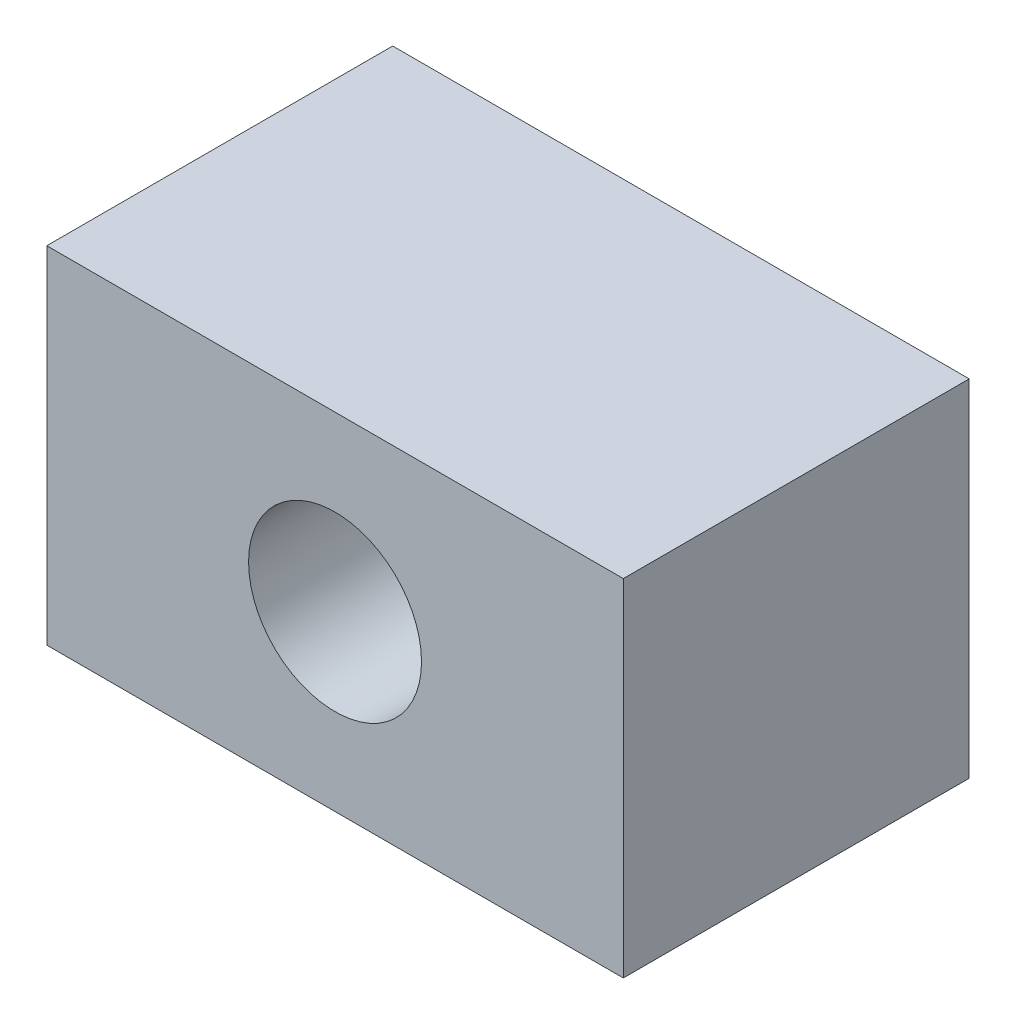
ISO-10303-21;
HEADER;
FILE_DESCRIPTION(('STEP AP214'),'2;1');
FILE_NAME('part.step','',(''),(''),'','','');
FILE_SCHEMA(('AUTOMOTIVE_DESIGN { 1 0 10303 214 1 1 1 1 }'));
ENDSEC;
DATA;
#1=APPLICATION_CONTEXT('core data for automotive mechanical design processes');
#2=APPLICATION_PROTOCOL_DEFINITION('international standard','automotive_design',2000,#1);
#3=PRODUCT_CONTEXT('',#1,'mechanical');
#4=PRODUCT('Part','Part','',(#3));
#5=PRODUCT_RELATED_PRODUCT_CATEGORY('part','',(#4));
#6=PRODUCT_DEFINITION_FORMATION('','',#4);
#7=PRODUCT_DEFINITION_CONTEXT('part definition',#1,'design');
#8=PRODUCT_DEFINITION('design','',#6,#7);
#9=PRODUCT_DEFINITION_SHAPE('','',#8);
#10=(LENGTH_UNIT() NAMED_UNIT(*) SI_UNIT(.MILLI.,.METRE.));
#11=(NAMED_UNIT(*) PLANE_ANGLE_UNIT() SI_UNIT($,.RADIAN.));
#12=(NAMED_UNIT(*) SI_UNIT($,.STERADIAN.) SOLID_ANGLE_UNIT());
#13=UNCERTAINTY_MEASURE_WITH_UNIT(LENGTH_MEASURE(1.E-05),#10,'distance_accuracy_value','');
#14=(GEOMETRIC_REPRESENTATION_CONTEXT(3) GLOBAL_UNCERTAINTY_ASSIGNED_CONTEXT((#13)) GLOBAL_UNIT_ASSIGNED_CONTEXT((#10,
#11,#12)) REPRESENTATION_CONTEXT('',''));
#15=CARTESIAN_POINT('',(0.,0.,0.));
#16=DIRECTION('',(0.,0.,1.));
#17=DIRECTION('',(1.,0.,0.));
#18=AXIS2_PLACEMENT_3D('',#15,#16,#17);
#19=CARTESIAN_POINT('',(50.,-15.,-15.));
#20=DIRECTION('',(0.,0.,1.));
#21=DIRECTION('',(1.,0.,0.));
#22=AXIS2_PLACEMENT_3D('',#19,#20,#21);
#23=PLANE('',#22);
#24=CARTESIAN_POINT('',(25.,0.,-15.));
#25=DIRECTION('',(0.,0.,1.));
#26=DIRECTION('',(1.,0.,0.));
#27=AXIS2_PLACEMENT_3D('',#24,#25,#26);
#28=CIRCLE('',#27,7.5);
#29=CARTESIAN_POINT('',(32.5,0.,-15.));
#30=VERTEX_POINT('',#29);
#31=EDGE_CURVE('E111',#30,#30,#28,.T.);
#32=ORIENTED_EDGE('',*,*,#31,.T.);
#33=EDGE_LOOP('',(#32));
#34=FACE_BOUND('',#33,.T.);
#35=DIRECTION('',(0.,1.,0.));
#36=VECTOR('',#35,1.);
#37=CARTESIAN_POINT('',(0.,-15.,-15.));
#38=LINE('',#37,#36);
#39=CARTESIAN_POINT('',(0.,-15.,-15.));
#40=VERTEX_POINT('',#39);
#41=CARTESIAN_POINT('',(0.,15.,-15.));
#42=VERTEX_POINT('',#41);
#43=EDGE_CURVE('E107',#40,#42,#38,.T.);
#44=ORIENTED_EDGE('',*,*,#43,.T.);
#45=DIRECTION('',(-1.,0.,0.));
#46=VECTOR('',#45,1.);
#47=CARTESIAN_POINT('',(50.,15.,-15.));
#48=LINE('',#47,#46);
#49=CARTESIAN_POINT('',(50.,15.,-15.));
#50=VERTEX_POINT('',#49);
#51=EDGE_CURVE('E11',#50,#42,#48,.T.);
#52=ORIENTED_EDGE('',*,*,#51,.F.);
#53=DIRECTION('',(0.,1.,0.));
#54=VECTOR('',#53,1.);
#55=CARTESIAN_POINT('',(50.,-15.,-15.));
#56=LINE('',#55,#54);
#57=CARTESIAN_POINT('',(50.,-15.,-15.));
#58=VERTEX_POINT('',#57);
#59=EDGE_CURVE('E91',#58,#50,#56,.T.);
#60=ORIENTED_EDGE('',*,*,#59,.F.);
#61=DIRECTION('',(-1.,0.,0.));
#62=VECTOR('',#61,1.);
#63=CARTESIAN_POINT('',(50.,-15.,-15.));
#64=LINE('',#63,#62);
#65=EDGE_CURVE('E103',#58,#40,#64,.T.);
#66=ORIENTED_EDGE('',*,*,#65,.T.);
#67=EDGE_LOOP('',(#44,#52,#60,#66));
#68=FACE_BOUND('',#67,.T.);
#69=ADVANCED_FACE('F39',(#34,#68),#23,.F.);
#70=CARTESIAN_POINT('',(50.,15.,15.));
#71=DIRECTION('',(0.,-1.,0.));
#72=DIRECTION('',(0.,0.,-1.));
#73=AXIS2_PLACEMENT_3D('',#70,#71,#72);
#74=PLANE('',#73);
#75=DIRECTION('',(0.,0.,1.));
#76=VECTOR('',#75,1.);
#77=CARTESIAN_POINT('',(0.,15.,15.));
#78=LINE('',#77,#76);
#79=CARTESIAN_POINT('',(0.,15.,15.));
#80=VERTEX_POINT('',#79);
#81=EDGE_CURVE('E96',#42,#80,#78,.T.);
#82=ORIENTED_EDGE('',*,*,#81,.T.);
#83=DIRECTION('',(-1.,0.,0.));
#84=VECTOR('',#83,1.);
#85=CARTESIAN_POINT('',(50.,15.,15.));
#86=LINE('',#85,#84);
#87=CARTESIAN_POINT('',(50.,15.,15.));
#88=VERTEX_POINT('',#87);
#89=EDGE_CURVE('E48',#88,#80,#86,.T.);
#90=ORIENTED_EDGE('',*,*,#89,.F.);
#91=DIRECTION('',(0.,0.,1.));
#92=VECTOR('',#91,1.);
#93=CARTESIAN_POINT('',(50.,15.,15.));
#94=LINE('',#93,#92);
#95=EDGE_CURVE('E86',#50,#88,#94,.T.);
#96=ORIENTED_EDGE('',*,*,#95,.F.);
#97=ORIENTED_EDGE('',*,*,#51,.T.);
#98=EDGE_LOOP('',(#82,#90,#96,#97));
#99=FACE_BOUND('',#98,.T.);
#100=ADVANCED_FACE('F95',(#99),#74,.F.);
#101=CARTESIAN_POINT('',(50.,-15.,15.));
#102=DIRECTION('',(0.,0.,-1.));
#103=DIRECTION('',(-1.,0.,0.));
#104=AXIS2_PLACEMENT_3D('',#101,#102,#103);
#105=PLANE('',#104);
#106=CARTESIAN_POINT('',(25.,0.,15.));
#107=DIRECTION('',(0.,0.,1.));
#108=DIRECTION('',(1.,0.,0.));
#109=AXIS2_PLACEMENT_3D('',#106,#107,#108);
#110=CIRCLE('',#109,7.5);
#111=CARTESIAN_POINT('',(32.5,0.,15.));
#112=VERTEX_POINT('',#111);
#113=EDGE_CURVE('E131',#112,#112,#110,.T.);
#114=ORIENTED_EDGE('',*,*,#113,.F.);
#115=EDGE_LOOP('',(#114));
#116=FACE_BOUND('',#115,.T.);
#117=DIRECTION('',(0.,-1.,0.));
#118=VECTOR('',#117,1.);
#119=CARTESIAN_POINT('',(0.,-15.,15.));
#120=LINE('',#119,#118);
#121=CARTESIAN_POINT('',(0.,-15.,15.));
#122=VERTEX_POINT('',#121);
#123=EDGE_CURVE('E73',#80,#122,#120,.T.);
#124=ORIENTED_EDGE('',*,*,#123,.T.);
#125=DIRECTION('',(-1.,0.,0.));
#126=VECTOR('',#125,1.);
#127=CARTESIAN_POINT('',(50.,-15.,15.));
#128=LINE('',#127,#126);
#129=CARTESIAN_POINT('',(50.,-15.,15.));
#130=VERTEX_POINT('',#129);
#131=EDGE_CURVE('E98',#130,#122,#128,.T.);
#132=ORIENTED_EDGE('',*,*,#131,.F.);
#133=DIRECTION('',(0.,-1.,0.));
#134=VECTOR('',#133,1.);
#135=CARTESIAN_POINT('',(50.,-15.,15.));
#136=LINE('',#135,#134);
#137=EDGE_CURVE('E89',#88,#130,#136,.T.);
#138=ORIENTED_EDGE('',*,*,#137,.F.);
#139=ORIENTED_EDGE('',*,*,#89,.T.);
#140=EDGE_LOOP('',(#124,#132,#138,#139));
#141=FACE_BOUND('',#140,.T.);
#142=ADVANCED_FACE('F99',(#116,#141),#105,.F.);
#143=CARTESIAN_POINT('',(50.,-15.,15.));
#144=DIRECTION('',(0.,1.,0.));
#145=DIRECTION('',(0.,0.,1.));
#146=AXIS2_PLACEMENT_3D('',#143,#144,#145);
#147=PLANE('',#146);
#148=DIRECTION('',(0.,0.,-1.));
#149=VECTOR('',#148,1.);
#150=CARTESIAN_POINT('',(0.,-15.,15.));
#151=LINE('',#150,#149);
#152=EDGE_CURVE('E79',#122,#40,#151,.T.);
#153=ORIENTED_EDGE('',*,*,#152,.T.);
#154=ORIENTED_EDGE('',*,*,#65,.F.);
#155=DIRECTION('',(0.,0.,-1.));
#156=VECTOR('',#155,1.);
#157=CARTESIAN_POINT('',(50.,-15.,15.));
#158=LINE('',#157,#156);
#159=EDGE_CURVE('E56',#130,#58,#158,.T.);
#160=ORIENTED_EDGE('',*,*,#159,.F.);
#161=ORIENTED_EDGE('',*,*,#131,.T.);
#162=EDGE_LOOP('',(#153,#154,#160,#161));
#163=FACE_BOUND('',#162,.T.);
#164=ADVANCED_FACE('F121',(#163),#147,.F.);
#165=CARTESIAN_POINT('',(50.,0.,0.));
#166=DIRECTION('',(-1.,0.,0.));
#167=DIRECTION('',(0.,0.,1.));
#168=AXIS2_PLACEMENT_3D('',#165,#166,#167);
#169=PLANE('',#168);
#170=ORIENTED_EDGE('',*,*,#59,.T.);
#171=ORIENTED_EDGE('',*,*,#95,.T.);
#172=ORIENTED_EDGE('',*,*,#137,.T.);
#173=ORIENTED_EDGE('',*,*,#159,.T.);
#174=EDGE_LOOP('',(#170,#171,#172,#173));
#175=FACE_BOUND('',#174,.T.);
#176=ADVANCED_FACE('F87',(#175),#169,.F.);
#177=CARTESIAN_POINT('',(0.,0.,0.));
#178=DIRECTION('',(-1.,0.,0.));
#179=DIRECTION('',(0.,0.,1.));
#180=AXIS2_PLACEMENT_3D('',#177,#178,#179);
#181=PLANE('',#180);
#182=ORIENTED_EDGE('',*,*,#43,.F.);
#183=ORIENTED_EDGE('',*,*,#152,.F.);
#184=ORIENTED_EDGE('',*,*,#123,.F.);
#185=ORIENTED_EDGE('',*,*,#81,.F.);
#186=EDGE_LOOP('',(#182,#183,#184,#185));
#187=FACE_BOUND('',#186,.T.);
#188=ADVANCED_FACE('F124',(#187),#181,.T.);
#189=CARTESIAN_POINT('',(25.,0.,-35.));
#190=DIRECTION('',(0.,0.,1.));
#191=DIRECTION('',(1.,0.,0.));
#192=AXIS2_PLACEMENT_3D('',#189,#190,#191);
#193=CYLINDRICAL_SURFACE('',#192,7.5);
#194=ORIENTED_EDGE('',*,*,#113,.T.);
#195=EDGE_LOOP('',(#194));
#196=FACE_BOUND('',#195,.T.);
#197=ORIENTED_EDGE('',*,*,#31,.F.);
#198=EDGE_LOOP('',(#197));
#199=FACE_BOUND('',#198,.T.);
#200=ADVANCED_FACE('F136',(#196,#199),#193,.F.);
#201=CLOSED_SHELL('',(#69,#100,#142,#164,#176,#188,#200));
#202=MANIFOLD_SOLID_BREP('B2',#201);
#203=ADVANCED_BREP_SHAPE_REPRESENTATION('',(#18,#202),#14);
#204=SHAPE_DEFINITION_REPRESENTATION(#9,#203);
ENDSEC;
END-ISO-10303-21;
